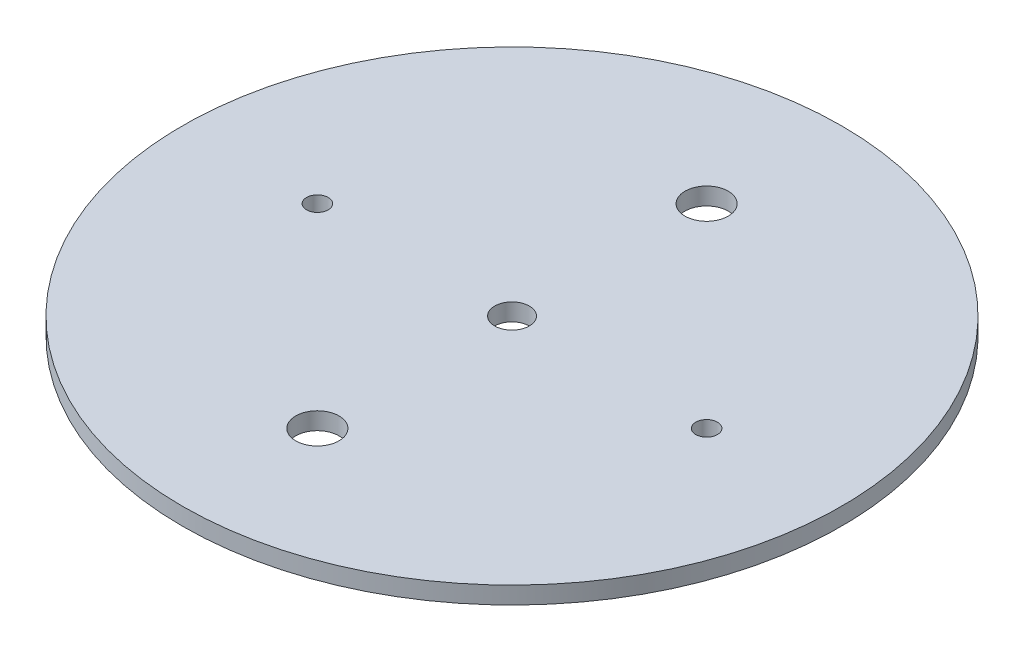
ISO-10303-21;
HEADER;
FILE_DESCRIPTION(('STEP AP214'),'2;1');
FILE_NAME('part.step','',(''),(''),'','','');
FILE_SCHEMA(('AUTOMOTIVE_DESIGN { 1 0 10303 214 1 1 1 1 }'));
ENDSEC;
DATA;
#1=APPLICATION_CONTEXT('core data for automotive mechanical design processes');
#2=APPLICATION_PROTOCOL_DEFINITION('international standard','automotive_design',2000,#1);
#3=PRODUCT_CONTEXT('',#1,'mechanical');
#4=PRODUCT('Part','Part','',(#3));
#5=PRODUCT_RELATED_PRODUCT_CATEGORY('part','',(#4));
#6=PRODUCT_DEFINITION_FORMATION('','',#4);
#7=PRODUCT_DEFINITION_CONTEXT('part definition',#1,'design');
#8=PRODUCT_DEFINITION('design','',#6,#7);
#9=PRODUCT_DEFINITION_SHAPE('','',#8);
#10=(LENGTH_UNIT() NAMED_UNIT(*) SI_UNIT(.MILLI.,.METRE.));
#11=(NAMED_UNIT(*) PLANE_ANGLE_UNIT() SI_UNIT($,.RADIAN.));
#12=(NAMED_UNIT(*) SI_UNIT($,.STERADIAN.) SOLID_ANGLE_UNIT());
#13=UNCERTAINTY_MEASURE_WITH_UNIT(LENGTH_MEASURE(1.E-05),#10,'distance_accuracy_value','');
#14=(GEOMETRIC_REPRESENTATION_CONTEXT(3) GLOBAL_UNCERTAINTY_ASSIGNED_CONTEXT((#13)) GLOBAL_UNIT_ASSIGNED_CONTEXT((#10,
#11,#12)) REPRESENTATION_CONTEXT('',''));
#15=CARTESIAN_POINT('',(0.,0.,0.));
#16=DIRECTION('',(0.,0.,1.));
#17=DIRECTION('',(1.,0.,0.));
#18=AXIS2_PLACEMENT_3D('',#15,#16,#17);
#19=CARTESIAN_POINT('',(0.,4.,45.));
#20=DIRECTION('',(0.,-1.,0.));
#21=DIRECTION('',(0.,0.,-1.));
#22=AXIS2_PLACEMENT_3D('',#19,#20,#21);
#23=CYLINDRICAL_SURFACE('',#22,5.);
#24=CARTESIAN_POINT('',(0.,4.,45.));
#25=DIRECTION('',(0.,1.,0.));
#26=DIRECTION('',(0.,0.,1.));
#27=AXIS2_PLACEMENT_3D('',#24,#25,#26);
#28=CIRCLE('',#27,5.);
#29=CARTESIAN_POINT('',(0.,4.,50.));
#30=VERTEX_POINT('',#29);
#31=EDGE_CURVE('E41',#30,#30,#28,.T.);
#32=ORIENTED_EDGE('',*,*,#31,.T.);
#33=EDGE_LOOP('',(#32));
#34=FACE_BOUND('',#33,.T.);
#35=CARTESIAN_POINT('',(0.,0.,45.));
#36=DIRECTION('',(0.,1.,0.));
#37=DIRECTION('',(0.,0.,1.));
#38=AXIS2_PLACEMENT_3D('',#35,#36,#37);
#39=CIRCLE('',#38,5.);
#40=CARTESIAN_POINT('',(0.,0.,50.));
#41=VERTEX_POINT('',#40);
#42=EDGE_CURVE('E61',#41,#41,#39,.T.);
#43=ORIENTED_EDGE('',*,*,#42,.F.);
#44=EDGE_LOOP('',(#43));
#45=FACE_BOUND('',#44,.T.);
#46=ADVANCED_FACE('F33',(#34,#45),#23,.F.);
#47=CARTESIAN_POINT('',(0.,4.,0.));
#48=DIRECTION('',(0.,-1.,0.));
#49=DIRECTION('',(0.,0.,-1.));
#50=AXIS2_PLACEMENT_3D('',#47,#48,#49);
#51=CYLINDRICAL_SURFACE('',#50,4.);
#52=CARTESIAN_POINT('',(0.,4.,0.));
#53=DIRECTION('',(0.,1.,0.));
#54=DIRECTION('',(0.,0.,1.));
#55=AXIS2_PLACEMENT_3D('',#52,#53,#54);
#56=CIRCLE('',#55,4.);
#57=CARTESIAN_POINT('',(0.,4.,4.));
#58=VERTEX_POINT('',#57);
#59=EDGE_CURVE('E46',#58,#58,#56,.T.);
#60=ORIENTED_EDGE('',*,*,#59,.T.);
#61=EDGE_LOOP('',(#60));
#62=FACE_BOUND('',#61,.T.);
#63=CARTESIAN_POINT('',(0.,0.,0.));
#64=DIRECTION('',(0.,1.,0.));
#65=DIRECTION('',(0.,0.,1.));
#66=AXIS2_PLACEMENT_3D('',#63,#64,#65);
#67=CIRCLE('',#66,4.);
#68=CARTESIAN_POINT('',(0.,0.,4.));
#69=VERTEX_POINT('',#68);
#70=EDGE_CURVE('E59',#69,#69,#67,.T.);
#71=ORIENTED_EDGE('',*,*,#70,.F.);
#72=EDGE_LOOP('',(#71));
#73=FACE_BOUND('',#72,.T.);
#74=ADVANCED_FACE('F82',(#62,#73),#51,.F.);
#75=CARTESIAN_POINT('',(45.,4.,0.));
#76=DIRECTION('',(0.,-1.,0.));
#77=DIRECTION('',(0.,0.,-1.));
#78=AXIS2_PLACEMENT_3D('',#75,#76,#77);
#79=CYLINDRICAL_SURFACE('',#78,2.5);
#80=CARTESIAN_POINT('',(45.,4.,0.));
#81=DIRECTION('',(0.,1.,0.));
#82=DIRECTION('',(0.,0.,1.));
#83=AXIS2_PLACEMENT_3D('',#80,#81,#82);
#84=CIRCLE('',#83,2.5);
#85=CARTESIAN_POINT('',(45.,4.,2.49999999999999));
#86=VERTEX_POINT('',#85);
#87=EDGE_CURVE('E75',#86,#86,#84,.T.);
#88=ORIENTED_EDGE('',*,*,#87,.T.);
#89=EDGE_LOOP('',(#88));
#90=FACE_BOUND('',#89,.T.);
#91=CARTESIAN_POINT('',(45.,0.,0.));
#92=DIRECTION('',(0.,1.,0.));
#93=DIRECTION('',(0.,0.,1.));
#94=AXIS2_PLACEMENT_3D('',#91,#92,#93);
#95=CIRCLE('',#94,2.5);
#96=CARTESIAN_POINT('',(45.,0.,2.49999999999999));
#97=VERTEX_POINT('',#96);
#98=EDGE_CURVE('E56',#97,#97,#95,.T.);
#99=ORIENTED_EDGE('',*,*,#98,.F.);
#100=EDGE_LOOP('',(#99));
#101=FACE_BOUND('',#100,.T.);
#102=ADVANCED_FACE('F99',(#90,#101),#79,.F.);
#103=CARTESIAN_POINT('',(-45.,4.,0.));
#104=DIRECTION('',(0.,-1.,0.));
#105=DIRECTION('',(0.,0.,-1.));
#106=AXIS2_PLACEMENT_3D('',#103,#104,#105);
#107=CYLINDRICAL_SURFACE('',#106,2.5);
#108=CARTESIAN_POINT('',(-45.,4.,0.));
#109=DIRECTION('',(0.,1.,0.));
#110=DIRECTION('',(0.,0.,1.));
#111=AXIS2_PLACEMENT_3D('',#108,#109,#110);
#112=CIRCLE('',#111,2.5);
#113=CARTESIAN_POINT('',(-45.,4.,2.50000000000001));
#114=VERTEX_POINT('',#113);
#115=EDGE_CURVE('E70',#114,#114,#112,.T.);
#116=ORIENTED_EDGE('',*,*,#115,.T.);
#117=EDGE_LOOP('',(#116));
#118=FACE_BOUND('',#117,.T.);
#119=CARTESIAN_POINT('',(-45.,0.,0.));
#120=DIRECTION('',(0.,1.,0.));
#121=DIRECTION('',(0.,0.,1.));
#122=AXIS2_PLACEMENT_3D('',#119,#120,#121);
#123=CIRCLE('',#122,2.5);
#124=CARTESIAN_POINT('',(-45.,0.,2.50000000000001));
#125=VERTEX_POINT('',#124);
#126=EDGE_CURVE('E53',#125,#125,#123,.T.);
#127=ORIENTED_EDGE('',*,*,#126,.F.);
#128=EDGE_LOOP('',(#127));
#129=FACE_BOUND('',#128,.T.);
#130=ADVANCED_FACE('F105',(#118,#129),#107,.F.);
#131=CARTESIAN_POINT('',(0.,4.,0.));
#132=DIRECTION('',(0.,-1.,0.));
#133=DIRECTION('',(0.,0.,-1.));
#134=AXIS2_PLACEMENT_3D('',#131,#132,#133);
#135=CYLINDRICAL_SURFACE('',#134,76.2);
#136=CARTESIAN_POINT('',(0.,4.,0.));
#137=DIRECTION('',(0.,1.,0.));
#138=DIRECTION('',(0.,0.,1.));
#139=AXIS2_PLACEMENT_3D('',#136,#137,#138);
#140=CIRCLE('',#139,76.2);
#141=CARTESIAN_POINT('',(0.,4.,76.2));
#142=VERTEX_POINT('',#141);
#143=EDGE_CURVE('E66',#142,#142,#140,.T.);
#144=ORIENTED_EDGE('',*,*,#143,.F.);
#145=EDGE_LOOP('',(#144));
#146=FACE_BOUND('',#145,.T.);
#147=CARTESIAN_POINT('',(0.,0.,0.));
#148=DIRECTION('',(0.,1.,0.));
#149=DIRECTION('',(0.,0.,1.));
#150=AXIS2_PLACEMENT_3D('',#147,#148,#149);
#151=CIRCLE('',#150,76.2);
#152=CARTESIAN_POINT('',(0.,0.,76.2));
#153=VERTEX_POINT('',#152);
#154=EDGE_CURVE('E50',#153,#153,#151,.T.);
#155=ORIENTED_EDGE('',*,*,#154,.T.);
#156=EDGE_LOOP('',(#155));
#157=FACE_BOUND('',#156,.T.);
#158=ADVANCED_FACE('F35',(#146,#157),#135,.T.);
#159=CARTESIAN_POINT('',(0.,4.,-45.));
#160=DIRECTION('',(0.,-1.,0.));
#161=DIRECTION('',(0.,0.,-1.));
#162=AXIS2_PLACEMENT_3D('',#159,#160,#161);
#163=CYLINDRICAL_SURFACE('',#162,5.);
#164=CARTESIAN_POINT('',(0.,4.,-45.));
#165=DIRECTION('',(0.,1.,0.));
#166=DIRECTION('',(0.,0.,1.));
#167=AXIS2_PLACEMENT_3D('',#164,#165,#166);
#168=CIRCLE('',#167,5.);
#169=CARTESIAN_POINT('',(0.,4.,-40.));
#170=VERTEX_POINT('',#169);
#171=EDGE_CURVE('E10',#170,#170,#168,.F.);
#172=ORIENTED_EDGE('',*,*,#171,.F.);
#173=EDGE_LOOP('',(#172));
#174=FACE_BOUND('',#173,.T.);
#175=CARTESIAN_POINT('',(0.,0.,-45.));
#176=DIRECTION('',(0.,1.,0.));
#177=DIRECTION('',(0.,0.,1.));
#178=AXIS2_PLACEMENT_3D('',#175,#176,#177);
#179=CIRCLE('',#178,5.);
#180=CARTESIAN_POINT('',(0.,0.,-40.));
#181=VERTEX_POINT('',#180);
#182=EDGE_CURVE('E37',#181,#181,#179,.F.);
#183=ORIENTED_EDGE('',*,*,#182,.T.);
#184=EDGE_LOOP('',(#183));
#185=FACE_BOUND('',#184,.T.);
#186=ADVANCED_FACE('F89',(#174,#185),#163,.F.);
#187=CARTESIAN_POINT('',(0.,4.,0.));
#188=DIRECTION('',(0.,1.,0.));
#189=DIRECTION('',(0.,0.,1.));
#190=AXIS2_PLACEMENT_3D('',#187,#188,#189);
#191=PLANE('',#190);
#192=ORIENTED_EDGE('',*,*,#143,.T.);
#193=EDGE_LOOP('',(#192));
#194=FACE_BOUND('',#193,.T.);
#195=ORIENTED_EDGE('',*,*,#115,.F.);
#196=EDGE_LOOP('',(#195));
#197=FACE_BOUND('',#196,.T.);
#198=ORIENTED_EDGE('',*,*,#87,.F.);
#199=EDGE_LOOP('',(#198));
#200=FACE_BOUND('',#199,.T.);
#201=ORIENTED_EDGE('',*,*,#59,.F.);
#202=EDGE_LOOP('',(#201));
#203=FACE_BOUND('',#202,.T.);
#204=ORIENTED_EDGE('',*,*,#31,.F.);
#205=EDGE_LOOP('',(#204));
#206=FACE_BOUND('',#205,.T.);
#207=ORIENTED_EDGE('',*,*,#171,.T.);
#208=EDGE_LOOP('',(#207));
#209=FACE_BOUND('',#208,.T.);
#210=ADVANCED_FACE('F85',(#194,#197,#200,#203,#206,#209),#191,.T.);
#211=CARTESIAN_POINT('',(0.,0.,0.));
#212=DIRECTION('',(0.,1.,0.));
#213=DIRECTION('',(0.,0.,1.));
#214=AXIS2_PLACEMENT_3D('',#211,#212,#213);
#215=PLANE('',#214);
#216=ORIENTED_EDGE('',*,*,#154,.F.);
#217=EDGE_LOOP('',(#216));
#218=FACE_BOUND('',#217,.T.);
#219=ORIENTED_EDGE('',*,*,#126,.T.);
#220=EDGE_LOOP('',(#219));
#221=FACE_BOUND('',#220,.T.);
#222=ORIENTED_EDGE('',*,*,#98,.T.);
#223=EDGE_LOOP('',(#222));
#224=FACE_BOUND('',#223,.T.);
#225=ORIENTED_EDGE('',*,*,#70,.T.);
#226=EDGE_LOOP('',(#225));
#227=FACE_BOUND('',#226,.T.);
#228=ORIENTED_EDGE('',*,*,#42,.T.);
#229=EDGE_LOOP('',(#228));
#230=FACE_BOUND('',#229,.T.);
#231=ORIENTED_EDGE('',*,*,#182,.F.);
#232=EDGE_LOOP('',(#231));
#233=FACE_BOUND('',#232,.T.);
#234=ADVANCED_FACE('F88',(#218,#221,#224,#227,#230,#233),#215,.F.);
#235=CLOSED_SHELL('',(#46,#74,#102,#130,#158,#186,#210,#234));
#236=MANIFOLD_SOLID_BREP('B2',#235);
#237=ADVANCED_BREP_SHAPE_REPRESENTATION('',(#18,#236),#14);
#238=SHAPE_DEFINITION_REPRESENTATION(#9,#237);
ENDSEC;
END-ISO-10303-21;
